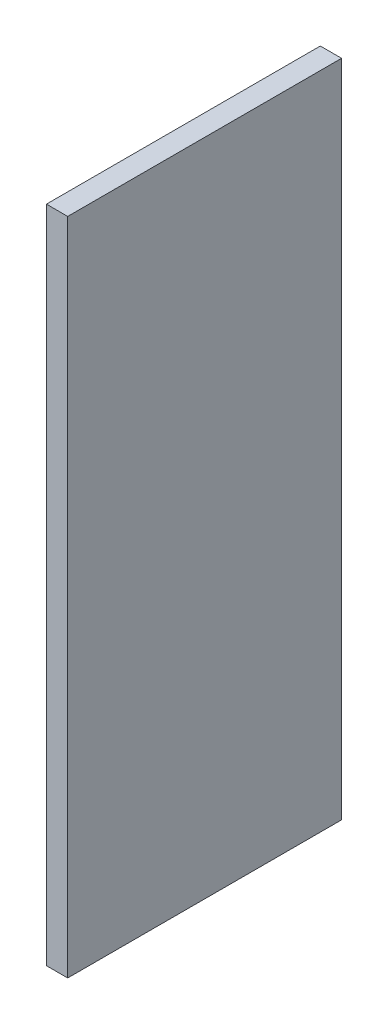
ISO-10303-21;
HEADER;
FILE_DESCRIPTION(('STEP AP214'),'2;1');
FILE_NAME('part.step','',(''),(''),'','','');
FILE_SCHEMA(('AUTOMOTIVE_DESIGN { 1 0 10303 214 1 1 1 1 }'));
ENDSEC;
DATA;
#1=APPLICATION_CONTEXT('core data for automotive mechanical design processes');
#2=APPLICATION_PROTOCOL_DEFINITION('international standard','automotive_design',2000,#1);
#3=PRODUCT_CONTEXT('',#1,'mechanical');
#4=PRODUCT('Part','Part','',(#3));
#5=PRODUCT_RELATED_PRODUCT_CATEGORY('part','',(#4));
#6=PRODUCT_DEFINITION_FORMATION('','',#4);
#7=PRODUCT_DEFINITION_CONTEXT('part definition',#1,'design');
#8=PRODUCT_DEFINITION('design','',#6,#7);
#9=PRODUCT_DEFINITION_SHAPE('','',#8);
#10=(LENGTH_UNIT() NAMED_UNIT(*) SI_UNIT(.MILLI.,.METRE.));
#11=(NAMED_UNIT(*) PLANE_ANGLE_UNIT() SI_UNIT($,.RADIAN.));
#12=(NAMED_UNIT(*) SI_UNIT($,.STERADIAN.) SOLID_ANGLE_UNIT());
#13=UNCERTAINTY_MEASURE_WITH_UNIT(LENGTH_MEASURE(1.E-05),#10,'distance_accuracy_value','');
#14=(GEOMETRIC_REPRESENTATION_CONTEXT(3) GLOBAL_UNCERTAINTY_ASSIGNED_CONTEXT((#13)) GLOBAL_UNIT_ASSIGNED_CONTEXT((#10,
#11,#12)) REPRESENTATION_CONTEXT('',''));
#15=CARTESIAN_POINT('',(0.,0.,0.));
#16=DIRECTION('',(0.,0.,1.));
#17=DIRECTION('',(1.,0.,0.));
#18=AXIS2_PLACEMENT_3D('',#15,#16,#17);
#19=CARTESIAN_POINT('',(1.5875,165.1,-19.05));
#20=DIRECTION('',(1.,0.,0.));
#21=DIRECTION('',(0.,0.,-1.));
#22=AXIS2_PLACEMENT_3D('',#19,#20,#21);
#23=PLANE('',#22);
#24=DIRECTION('',(0.,0.,1.));
#25=VECTOR('',#24,1.);
#26=CARTESIAN_POINT('',(1.5875,0.,-19.05));
#27=LINE('',#26,#25);
#28=CARTESIAN_POINT('',(1.5875,0.,-20.4343));
#29=VERTEX_POINT('',#28);
#30=CARTESIAN_POINT('',(1.5875,0.,20.4343));
#31=VERTEX_POINT('',#30);
#32=EDGE_CURVE('E81',#29,#31,#27,.T.);
#33=ORIENTED_EDGE('',*,*,#32,.F.);
#34=DIRECTION('',(0.,-1.,0.));
#35=VECTOR('',#34,1.);
#36=CARTESIAN_POINT('',(1.5875,165.1,-20.4343));
#37=LINE('',#36,#35);
#38=CARTESIAN_POINT('',(1.5875,98.425,-20.4343));
#39=VERTEX_POINT('',#38);
#40=EDGE_CURVE('E35',#39,#29,#37,.T.);
#41=ORIENTED_EDGE('',*,*,#40,.F.);
#42=DIRECTION('',(0.,0.,1.));
#43=VECTOR('',#42,1.);
#44=CARTESIAN_POINT('',(1.5875,98.425,-19.05));
#45=LINE('',#44,#43);
#46=CARTESIAN_POINT('',(1.5875,98.425,20.4343));
#47=VERTEX_POINT('',#46);
#48=EDGE_CURVE('E72',#39,#47,#45,.T.);
#49=ORIENTED_EDGE('',*,*,#48,.T.);
#50=DIRECTION('',(0.,-1.,0.));
#51=VECTOR('',#50,1.);
#52=CARTESIAN_POINT('',(1.5875,165.1,20.4343));
#53=LINE('',#52,#51);
#54=EDGE_CURVE('E10',#47,#31,#53,.T.);
#55=ORIENTED_EDGE('',*,*,#54,.T.);
#56=EDGE_LOOP('',(#33,#41,#49,#55));
#57=FACE_BOUND('',#56,.T.);
#58=ADVANCED_FACE('F16',(#57),#23,.T.);
#59=CARTESIAN_POINT('',(1.5875,165.1,20.4343));
#60=DIRECTION('',(0.,0.,1.));
#61=DIRECTION('',(1.,0.,0.));
#62=AXIS2_PLACEMENT_3D('',#59,#60,#61);
#63=PLANE('',#62);
#64=DIRECTION('',(-1.,0.,0.));
#65=VECTOR('',#64,1.);
#66=CARTESIAN_POINT('',(1.5875,0.,20.4343));
#67=LINE('',#66,#65);
#68=CARTESIAN_POINT('',(-1.5875,0.,20.4343));
#69=VERTEX_POINT('',#68);
#70=EDGE_CURVE('E75',#31,#69,#67,.T.);
#71=ORIENTED_EDGE('',*,*,#70,.F.);
#72=ORIENTED_EDGE('',*,*,#54,.F.);
#73=DIRECTION('',(-1.,0.,0.));
#74=VECTOR('',#73,1.);
#75=CARTESIAN_POINT('',(1.5875,98.425,20.4343));
#76=LINE('',#75,#74);
#77=CARTESIAN_POINT('',(-1.5875,98.425,20.4343));
#78=VERTEX_POINT('',#77);
#79=EDGE_CURVE('E87',#47,#78,#76,.T.);
#80=ORIENTED_EDGE('',*,*,#79,.T.);
#81=DIRECTION('',(0.,-1.,0.));
#82=VECTOR('',#81,1.);
#83=CARTESIAN_POINT('',(-1.5875,165.1,20.4343));
#84=LINE('',#83,#82);
#85=EDGE_CURVE('E26',#78,#69,#84,.T.);
#86=ORIENTED_EDGE('',*,*,#85,.T.);
#87=EDGE_LOOP('',(#71,#72,#80,#86));
#88=FACE_BOUND('',#87,.T.);
#89=ADVANCED_FACE('F96',(#88),#63,.T.);
#90=CARTESIAN_POINT('',(-1.5875,165.1,19.05));
#91=DIRECTION('',(-1.,0.,0.));
#92=DIRECTION('',(0.,0.,1.));
#93=AXIS2_PLACEMENT_3D('',#90,#91,#92);
#94=PLANE('',#93);
#95=DIRECTION('',(0.,0.,-1.));
#96=VECTOR('',#95,1.);
#97=CARTESIAN_POINT('',(-1.5875,0.,19.05));
#98=LINE('',#97,#96);
#99=CARTESIAN_POINT('',(-1.5875,0.,-20.4343));
#100=VERTEX_POINT('',#99);
#101=EDGE_CURVE('E61',#69,#100,#98,.T.);
#102=ORIENTED_EDGE('',*,*,#101,.F.);
#103=ORIENTED_EDGE('',*,*,#85,.F.);
#104=DIRECTION('',(0.,0.,-1.));
#105=VECTOR('',#104,1.);
#106=CARTESIAN_POINT('',(-1.5875,98.425,19.05));
#107=LINE('',#106,#105);
#108=CARTESIAN_POINT('',(-1.5875,98.425,-20.4343));
#109=VERTEX_POINT('',#108);
#110=EDGE_CURVE('E64',#78,#109,#107,.T.);
#111=ORIENTED_EDGE('',*,*,#110,.T.);
#112=DIRECTION('',(0.,-1.,0.));
#113=VECTOR('',#112,1.);
#114=CARTESIAN_POINT('',(-1.5875,165.1,-20.4343));
#115=LINE('',#114,#113);
#116=EDGE_CURVE('E20',#109,#100,#115,.T.);
#117=ORIENTED_EDGE('',*,*,#116,.T.);
#118=EDGE_LOOP('',(#102,#103,#111,#117));
#119=FACE_BOUND('',#118,.T.);
#120=ADVANCED_FACE('F59',(#119),#94,.T.);
#121=CARTESIAN_POINT('',(-1.5875,165.1,-20.4343));
#122=DIRECTION('',(0.,0.,-1.));
#123=DIRECTION('',(-1.,0.,0.));
#124=AXIS2_PLACEMENT_3D('',#121,#122,#123);
#125=PLANE('',#124);
#126=DIRECTION('',(1.,0.,0.));
#127=VECTOR('',#126,1.);
#128=CARTESIAN_POINT('',(-1.5875,0.,-20.4343));
#129=LINE('',#128,#127);
#130=EDGE_CURVE('E68',#100,#29,#129,.T.);
#131=ORIENTED_EDGE('',*,*,#130,.F.);
#132=ORIENTED_EDGE('',*,*,#116,.F.);
#133=DIRECTION('',(1.,0.,0.));
#134=VECTOR('',#133,1.);
#135=CARTESIAN_POINT('',(-1.5875,98.425,-20.4343));
#136=LINE('',#135,#134);
#137=EDGE_CURVE('E88',#109,#39,#136,.T.);
#138=ORIENTED_EDGE('',*,*,#137,.T.);
#139=ORIENTED_EDGE('',*,*,#40,.T.);
#140=EDGE_LOOP('',(#131,#132,#138,#139));
#141=FACE_BOUND('',#140,.T.);
#142=ADVANCED_FACE('F18',(#141),#125,.T.);
#143=CARTESIAN_POINT('',(0.,98.425,0.));
#144=DIRECTION('',(0.,-1.,0.));
#145=DIRECTION('',(0.,0.,-1.));
#146=AXIS2_PLACEMENT_3D('',#143,#144,#145);
#147=PLANE('',#146);
#148=ORIENTED_EDGE('',*,*,#48,.F.);
#149=ORIENTED_EDGE('',*,*,#137,.F.);
#150=ORIENTED_EDGE('',*,*,#110,.F.);
#151=ORIENTED_EDGE('',*,*,#79,.F.);
#152=EDGE_LOOP('',(#148,#149,#150,#151));
#153=FACE_BOUND('',#152,.T.);
#154=ADVANCED_FACE('F95',(#153),#147,.F.);
#155=CARTESIAN_POINT('',(0.,0.,0.));
#156=DIRECTION('',(0.,-1.,0.));
#157=DIRECTION('',(0.,0.,-1.));
#158=AXIS2_PLACEMENT_3D('',#155,#156,#157);
#159=PLANE('',#158);
#160=ORIENTED_EDGE('',*,*,#32,.T.);
#161=ORIENTED_EDGE('',*,*,#70,.T.);
#162=ORIENTED_EDGE('',*,*,#101,.T.);
#163=ORIENTED_EDGE('',*,*,#130,.T.);
#164=EDGE_LOOP('',(#160,#161,#162,#163));
#165=FACE_BOUND('',#164,.T.);
#166=ADVANCED_FACE('F74',(#165),#159,.T.);
#167=CLOSED_SHELL('',(#58,#89,#120,#142,#154,#166));
#168=MANIFOLD_SOLID_BREP('B1',#167);
#169=ADVANCED_BREP_SHAPE_REPRESENTATION('',(#18,#168),#14);
#170=SHAPE_DEFINITION_REPRESENTATION(#9,#169);
ENDSEC;
END-ISO-10303-21;
